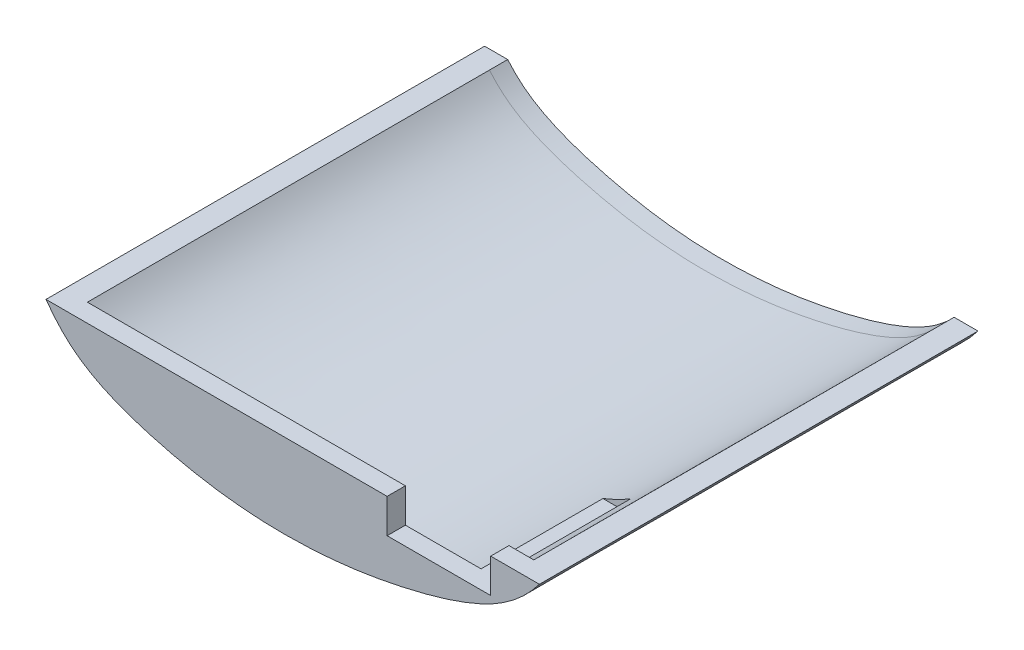
ISO-10303-21;
HEADER;
FILE_DESCRIPTION(('STEP AP214'),'2;1');
FILE_NAME('part.step','',(''),(''),'','','');
FILE_SCHEMA(('AUTOMOTIVE_DESIGN { 1 0 10303 214 1 1 1 1 }'));
ENDSEC;
DATA;
#1=APPLICATION_CONTEXT('core data for automotive mechanical design processes');
#2=APPLICATION_PROTOCOL_DEFINITION('international standard','automotive_design',2000,#1);
#3=PRODUCT_CONTEXT('',#1,'mechanical');
#4=PRODUCT('Part','Part','',(#3));
#5=PRODUCT_RELATED_PRODUCT_CATEGORY('part','',(#4));
#6=PRODUCT_DEFINITION_FORMATION('','',#4);
#7=PRODUCT_DEFINITION_CONTEXT('part definition',#1,'design');
#8=PRODUCT_DEFINITION('design','',#6,#7);
#9=PRODUCT_DEFINITION_SHAPE('','',#8);
#10=(LENGTH_UNIT() NAMED_UNIT(*) SI_UNIT(.MILLI.,.METRE.));
#11=(NAMED_UNIT(*) PLANE_ANGLE_UNIT() SI_UNIT($,.RADIAN.));
#12=(NAMED_UNIT(*) SI_UNIT($,.STERADIAN.) SOLID_ANGLE_UNIT());
#13=UNCERTAINTY_MEASURE_WITH_UNIT(LENGTH_MEASURE(1.E-05),#10,'distance_accuracy_value','');
#14=(GEOMETRIC_REPRESENTATION_CONTEXT(3) GLOBAL_UNCERTAINTY_ASSIGNED_CONTEXT((#13)) GLOBAL_UNIT_ASSIGNED_CONTEXT((#10,
#11,#12)) REPRESENTATION_CONTEXT('',''));
#15=CARTESIAN_POINT('',(0.,0.,0.));
#16=DIRECTION('',(0.,0.,1.));
#17=DIRECTION('',(1.,0.,0.));
#18=AXIS2_PLACEMENT_3D('',#15,#16,#17);
#19=CARTESIAN_POINT('',(40.5,-2.,6.));
#20=DIRECTION('',(0.,1.,0.));
#21=DIRECTION('',(0.,0.,1.));
#22=AXIS2_PLACEMENT_3D('',#19,#20,#21);
#23=PLANE('',#22);
#24=DIRECTION('',(0.,0.,1.));
#25=VECTOR('',#24,1.);
#26=CARTESIAN_POINT('',(28.,-2.,6.));
#27=LINE('',#26,#25);
#28=CARTESIAN_POINT('',(28.,-2.,40.5));
#29=VERTEX_POINT('',#28);
#30=CARTESIAN_POINT('',(28.,-2.,42.));
#31=VERTEX_POINT('',#30);
#32=EDGE_CURVE('E137',#29,#31,#27,.T.);
#33=ORIENTED_EDGE('',*,*,#32,.F.);
#34=DIRECTION('',(-1.,0.,0.));
#35=VECTOR('',#34,1.);
#36=CARTESIAN_POINT('',(40.5,-2.,40.5));
#37=LINE('',#36,#35);
#38=CARTESIAN_POINT('',(1.89820136982671,-2.,40.5));
#39=VERTEX_POINT('',#38);
#40=EDGE_CURVE('E273',#29,#39,#37,.T.);
#41=ORIENTED_EDGE('',*,*,#40,.T.);
#42=DIRECTION('',(0.,0.,1.));
#43=VECTOR('',#42,1.);
#44=CARTESIAN_POINT('',(1.89820136982671,-2.,40.5));
#45=LINE('',#44,#43);
#46=CARTESIAN_POINT('',(1.89820136982672,-2.,7.5));
#47=VERTEX_POINT('',#46);
#48=EDGE_CURVE('E341',#39,#47,#45,.F.);
#49=ORIENTED_EDGE('',*,*,#48,.T.);
#50=DIRECTION('',(0.,0.,1.));
#51=VECTOR('',#50,1.);
#52=CARTESIAN_POINT('',(1.89820136982672,-2.,5.85000000000009));
#53=LINE('',#52,#51);
#54=CARTESIAN_POINT('',(1.89820136982672,-2.,6.));
#55=VERTEX_POINT('',#54);
#56=EDGE_CURVE('E176',#55,#47,#53,.T.);
#57=ORIENTED_EDGE('',*,*,#56,.F.);
#58=DIRECTION('',(-1.,0.,0.));
#59=VECTOR('',#58,1.);
#60=CARTESIAN_POINT('',(40.5,-2.,6.));
#61=LINE('',#60,#59);
#62=CARTESIAN_POINT('',(0.000230500000000689,-2.,6.));
#63=VERTEX_POINT('',#62);
#64=EDGE_CURVE('E241',#55,#63,#61,.T.);
#65=ORIENTED_EDGE('',*,*,#64,.T.);
#66=DIRECTION('',(0.,0.,1.));
#67=VECTOR('',#66,1.);
#68=CARTESIAN_POINT('',(0.000230500000000689,-2.,6.));
#69=LINE('',#68,#67);
#70=CARTESIAN_POINT('',(0.000230500000000689,-2.,42.));
#71=VERTEX_POINT('',#70);
#72=EDGE_CURVE('E327',#71,#63,#69,.F.);
#73=ORIENTED_EDGE('',*,*,#72,.F.);
#74=DIRECTION('',(-1.,0.,0.));
#75=VECTOR('',#74,1.);
#76=CARTESIAN_POINT('',(40.5,-2.,42.));
#77=LINE('',#76,#75);
#78=EDGE_CURVE('E315',#31,#71,#77,.T.);
#79=ORIENTED_EDGE('',*,*,#78,.F.);
#80=EDGE_LOOP('',(#33,#41,#49,#57,#65,#73,#79));
#81=FACE_BOUND('',#80,.T.);
#82=ADVANCED_FACE('F17',(#81),#23,.T.);
#83=CARTESIAN_POINT('',(19.8662950637951,-8.90434168798936,40.5));
#84=DIRECTION('',(0.,0.,-1.));
#85=DIRECTION('',(1.,0.,0.));
#86=AXIS2_PLACEMENT_3D('',#83,#84,#85);
#87=PLANE('',#86);
#88=DIRECTION('',(0.,-1.,0.));
#89=VECTOR('',#88,1.);
#90=CARTESIAN_POINT('',(36.5,-8.90434168798936,40.5));
#91=LINE('',#90,#89);
#92=CARTESIAN_POINT('',(36.5,-2.,40.5));
#93=VERTEX_POINT('',#92);
#94=CARTESIAN_POINT('',(36.5,-3.66892450240121,40.5));
#95=VERTEX_POINT('',#94);
#96=EDGE_CURVE('E31',#93,#95,#91,.T.);
#97=ORIENTED_EDGE('',*,*,#96,.F.);
#98=CARTESIAN_POINT('',(38.5382006752774,-2.,40.5));
#99=VERTEX_POINT('',#98);
#100=EDGE_CURVE('E265',#99,#93,#37,.T.);
#101=ORIENTED_EDGE('',*,*,#100,.F.);
#102=CARTESIAN_POINT('',(1.89820136982671,-2.,40.5));
#103=CARTESIAN_POINT('',(2.00083003310664,-2.12041762852252,40.5000000000001));
#104=CARTESIAN_POINT('',(2.10604483115259,-2.2386689501225,40.5000000000001));
#105=CARTESIAN_POINT('',(2.32152162943008,-2.46989976937524,40.5000000000001));
#106=CARTESIAN_POINT('',(2.43176978911935,-2.58289217985561,40.5000000000001));
#107=CARTESIAN_POINT('',(2.65749913152029,-2.80308300431878,40.5000000000001));
#108=CARTESIAN_POINT('',(2.77296963343779,-2.91029234097288,40.5000000000001));
#109=CARTESIAN_POINT('',(3.0092273969493,-3.11848265996382,40.5000000000001));
#110=CARTESIAN_POINT('',(3.13000976892064,-3.21946917300463,40.5000000000001));
#111=CARTESIAN_POINT('',(3.31400481589099,-3.36512382245532,40.5000000000001));
#112=CARTESIAN_POINT('',(3.3752422842266,-3.4123044454689,40.5000000000001));
#113=CARTESIAN_POINT('',(3.49895302951827,-3.50501686976352,40.5000000000001));
#114=CARTESIAN_POINT('',(3.5614263022646,-3.55054867665973,40.5000000000001));
#115=CARTESIAN_POINT('',(3.75058784602209,-3.68475970057501,40.5000000000001));
#116=CARTESIAN_POINT('',(3.87899015133936,-3.77103267368491,40.5000000000001));
#117=CARTESIAN_POINT('',(4.13957950097387,-3.93777326007497,40.5000000000001));
#118=CARTESIAN_POINT('',(4.27176845847251,-4.01823786378506,40.5000000000001));
#119=CARTESIAN_POINT('',(4.53923264428156,-4.17383906765259,40.5000000000001));
#120=CARTESIAN_POINT('',(4.67450785773528,-4.24897569345086,40.5));
#121=CARTESIAN_POINT('',(5.0546255834656,-4.45140412085583,40.5));
#122=CARTESIAN_POINT('',(5.30227488557212,-4.57343682116008,40.5));
#123=CARTESIAN_POINT('',(5.80360238994257,-4.8045988584823,40.5000000000001));
#124=CARTESIAN_POINT('',(6.0572836542603,-4.91372146632188,40.5000000000001));
#125=CARTESIAN_POINT('',(6.56940721361049,-5.1211454808542,40.5000000000001));
#126=CARTESIAN_POINT('',(6.82785550446699,-5.21943199610056,40.5000000000001));
#127=CARTESIAN_POINT('',(7.34837087425427,-5.40680142478395,40.5000000000001));
#128=CARTESIAN_POINT('',(7.61044169005245,-5.49587388202048,40.5000000000001));
#129=CARTESIAN_POINT('',(8.1371729088616,-5.66614845948441,40.5000000000001));
#130=CARTESIAN_POINT('',(8.40183384328292,-5.74734892570979,40.5000000000001));
#131=CARTESIAN_POINT('',(8.93792621938398,-5.90453680297366,40.5000000000001));
#132=CARTESIAN_POINT('',(9.20939320667267,-5.98040240723568,40.5000000000001));
#133=CARTESIAN_POINT('',(9.61756590533864,-6.08991354173451,40.5000000000001));
#134=CARTESIAN_POINT('',(9.75370766127733,-6.12568354566409,40.5000000000001));
#135=CARTESIAN_POINT('',(10.0263203742806,-6.19594657658084,40.5000000000001));
#136=CARTESIAN_POINT('',(10.1627913309865,-6.23043960495853,40.5));
#137=CARTESIAN_POINT('',(10.5724896740277,-6.33188780720992,40.5));
#138=CARTESIAN_POINT('',(10.8462092540068,-6.39686754399802,40.5));
#139=CARTESIAN_POINT('',(11.3947981603253,-6.52125797375342,40.5));
#140=CARTESIAN_POINT('',(11.6696669876823,-6.58067086493684,40.5));
#141=CARTESIAN_POINT('',(12.220592478091,-6.69369944993921,40.5));
#142=CARTESIAN_POINT('',(12.4966491490258,-6.74731510522264,40.5));
#143=CARTESIAN_POINT('',(13.3088512312554,-6.89588400854173,40.5));
#144=CARTESIAN_POINT('',(13.8465434657899,-6.98254664257681,40.5));
#145=CARTESIAN_POINT('',(14.925550010286,-7.13202365999072,40.5));
#146=CARTESIAN_POINT('',(15.4668662640761,-7.19482399101907,40.5));
#147=CARTESIAN_POINT('',(16.5519905380727,-7.29605759648399,40.5));
#148=CARTESIAN_POINT('',(17.0957994584553,-7.33448123155406,40.5));
#149=CARTESIAN_POINT('',(18.1846642227836,-7.3874093071454,40.5));
#150=CARTESIAN_POINT('',(18.7297202727932,-7.40190945833182,40.5));
#151=CARTESIAN_POINT('',(19.8144430594335,-7.40833327706315,40.5));
#152=CARTESIAN_POINT('',(20.3541087939234,-7.40048282408675,40.5));
#153=CARTESIAN_POINT('',(21.4327440426455,-7.36494611703388,40.5));
#154=CARTESIAN_POINT('',(21.9717136009242,-7.33726118634803,40.5));
#155=CARTESIAN_POINT('',(23.0480711376848,-7.26102744177884,40.5));
#156=CARTESIAN_POINT('',(23.5854594344493,-7.21248316377933,40.5));
#157=CARTESIAN_POINT('',(24.6577623140746,-7.09453591233781,40.5));
#158=CARTESIAN_POINT('',(25.1926776415342,-7.02513969757321,40.5));
#159=CARTESIAN_POINT('',(26.1202087326554,-6.8872873138493,40.5));
#160=CARTESIAN_POINT('',(26.513499425086,-6.82331990477343,40.5));
#161=CARTESIAN_POINT('',(27.1020773115475,-6.71978669216772,40.4999999999999));
#162=CARTESIAN_POINT('',(27.2980381348379,-6.68401304166714,40.4999999999999));
#163=CARTESIAN_POINT('',(27.6895015543667,-6.61003352364393,40.4999999999999));
#164=CARTESIAN_POINT('',(27.8850041490312,-6.57182764777995,40.4999999999999));
#165=CARTESIAN_POINT('',(28.2755714890389,-6.49306944692754,40.4999999999999));
#166=CARTESIAN_POINT('',(28.4706361504276,-6.45251670629462,40.4999999999999));
#167=CARTESIAN_POINT('',(28.8602915934307,-6.3691946903258,40.4999999999999));
#168=CARTESIAN_POINT('',(29.0548823745473,-6.32642541266187,40.4999999999999));
#169=CARTESIAN_POINT('',(29.4445603998845,-6.23832645313602,40.4999999999999));
#170=CARTESIAN_POINT('',(29.6396448744314,-6.19298449066991,40.4999999999999));
#171=CARTESIAN_POINT('',(30.0292035512473,-6.09975630626065,40.4999999999999));
#172=CARTESIAN_POINT('',(30.2236777549775,-6.05187009041464,40.4999999999999));
#173=CARTESIAN_POINT('',(30.8059946979535,-5.90411890653884,40.4999999999999));
#174=CARTESIAN_POINT('',(31.1928065625797,-5.80014465524086,40.4999999999999));
#175=CARTESIAN_POINT('',(31.9626583881571,-5.57926894043876,40.4999999999999));
#176=CARTESIAN_POINT('',(32.345699288834,-5.46237079118438,40.5));
#177=CARTESIAN_POINT('',(32.9085383136561,-5.27779342485046,40.5));
#178=CARTESIAN_POINT('',(33.090329923843,-5.21617355536031,40.4999999999999));
#179=CARTESIAN_POINT('',(33.4525025464162,-5.08890481034306,40.4999999999999));
#180=CARTESIAN_POINT('',(33.6328835626763,-5.02325594588432,40.4999999999999));
#181=CARTESIAN_POINT('',(33.9920376702233,-4.88742329757447,40.4999999999999));
#182=CARTESIAN_POINT('',(34.170809913008,-4.81723726406419,40.4999999999999));
#183=CARTESIAN_POINT('',(34.5262844728385,-4.67177784632501,40.4999999999999));
#184=CARTESIAN_POINT('',(34.7029867593906,-4.59650438726059,40.4999999999999));
#185=CARTESIAN_POINT('',(35.0522940435741,-4.44083449431221,40.4999999999999));
#186=CARTESIAN_POINT('',(35.2249212806481,-4.36048812529077,40.4999999999999));
#187=CARTESIAN_POINT('',(35.5669918614827,-4.19322187487431,40.4999999999999));
#188=CARTESIAN_POINT('',(35.7364351625076,-4.10630190532519,40.4999999999999));
#189=CARTESIAN_POINT('',(35.9873830857114,-3.97020859944181,40.4999999999999));
#190=CARTESIAN_POINT('',(36.0704543159964,-3.92391721759707,40.4999999999999));
#191=CARTESIAN_POINT('',(36.2354009755563,-3.82925217690623,40.4999999999999));
#192=CARTESIAN_POINT('',(36.3172763991931,-3.78087850824662,40.4999999999999));
#193=CARTESIAN_POINT('',(36.5609375507431,-3.63260189795209,40.4999999999999));
#194=CARTESIAN_POINT('',(36.7208102423147,-3.52951526348172,40.5));
#195=CARTESIAN_POINT('',(36.9775858528581,-3.35377984136878,40.5));
#196=CARTESIAN_POINT('',(37.0762522760367,-3.28368936064456,40.4999999999999));
#197=CARTESIAN_POINT('',(37.2710356941909,-3.14001542563336,40.4999999999998));
#198=CARTESIAN_POINT('',(37.3671523366213,-3.06643149220786,40.4999999999999));
#199=CARTESIAN_POINT('',(37.5566631133341,-2.91582550336033,40.4999999999999));
#200=CARTESIAN_POINT('',(37.6500570571815,-2.83880320839679,40.4999999999999));
#201=CARTESIAN_POINT('',(37.8350042780706,-2.68054557293241,40.4999999999999));
#202=CARTESIAN_POINT('',(37.9265257300119,-2.59927303016159,40.4999999999999));
#203=CARTESIAN_POINT('',(38.106539252317,-2.43345247371134,40.4999999999999));
#204=CARTESIAN_POINT('',(38.1950315063444,-2.34890465928029,40.4999999999998));
#205=CARTESIAN_POINT('',(38.368934207929,-2.17672379115764,40.4999999999999));
#206=CARTESIAN_POINT('',(38.4543451529351,-2.08909124002239,40.4999999999999));
#207=CARTESIAN_POINT('',(38.5382006752774,-2.,40.5));
#208=B_SPLINE_CURVE_WITH_KNOTS('',3,(#102,#103,#104,#105,#106,#107,#108,#109,#110,#111,#112,
#113,#114,#115,#116,#117,#118,#119,#120,#121,#122,#123,#124,#125,#126,#127,#128,#129,#130,#131,
#132,#133,#134,#135,#136,#137,#138,#139,#140,#141,#142,#143,#144,#145,#146,#147,#148,#149,#150,
#151,#152,#153,#154,#155,#156,#157,#158,#159,#160,#161,#162,#163,#164,#165,#166,#167,#168,#169,
#170,#171,#172,#173,#174,#175,#176,#177,#178,#179,#180,#181,#182,#183,#184,#185,#186,#187,#188,
#189,#190,#191,#192,#193,#194,#195,#196,#197,#198,#199,#200,#201,#202,#203,#204,#205,#206,#207),
.UNSPECIFIED.,.F.,.F.,(4,2,2,2,2,2,2,2,2,2,2,2,2,2,2,2,2,2,2,2,2,2,2,2,2,2,2,2,2,2,2,2,2,2,2,2,
2,2,2,2,2,2,2,2,2,2,2,2,2,2,2,2,4),(0.,0.474662618182783,0.948090556586381,1.42059053112625,
1.89266431426562,2.124555357897,2.35644561173245,2.82033180275154,3.28445665338628,
3.74857927027525,4.57633057780913,5.4045114540942,6.23381662867832,7.06405281411066,
7.89446306599801,8.73999007087165,9.16227263424755,9.58455473778335,10.4284769700363,
11.2720645403418,12.1156577178169,13.748998990029,15.3833006407224,17.0182481471733,
18.6534887579045,20.2722621526471,21.8909275500895,23.5092411452669,25.1270307659723,
26.3222669065307,26.9198516418769,27.5174384267608,28.1151313738542,28.7128249487172,
29.3136613160345,29.9144962435476,31.1159362400249,32.3170688465602,32.8928839052729,
33.4686973821903,34.0447985869817,34.6209082680097,35.1920239342125,35.7631472606183,
36.0484155907542,36.3336852654649,36.9040472933925,37.26706484442,37.6301323291517,
37.9932251474255,38.3603377717367,38.7274280980246,39.0944588933234),.UNSPECIFIED.);
#209=EDGE_CURVE('E263',#95,#99,#208,.T.);
#210=ORIENTED_EDGE('',*,*,#209,.F.);
#211=EDGE_LOOP('',(#97,#101,#210));
#212=FACE_BOUND('',#211,.T.);
#213=ADVANCED_FACE('F264',(#212),#87,.T.);
#214=CARTESIAN_POINT('',(19.8662950637951,-8.90434168798935,6.));
#215=DIRECTION('',(0.,0.,-1.));
#216=DIRECTION('',(1.,0.,0.));
#217=AXIS2_PLACEMENT_3D('',#214,#215,#216);
#218=PLANE('',#217);
#219=ORIENTED_EDGE('',*,*,#64,.F.);
#220=CARTESIAN_POINT('',(1.89820136982672,-2.,6.00000000000009));
#221=CARTESIAN_POINT('',(2.16697650434004,-2.31529273616505,6.00000000000009));
#222=CARTESIAN_POINT('',(2.45037312983766,-2.61224095305659,6.00000000000009));
#223=CARTESIAN_POINT('',(3.05091479946776,-3.16379570521762,6.00000000000009));
#224=CARTESIAN_POINT('',(3.36828874709754,-3.41811505194914,6.00000000000009));
#225=CARTESIAN_POINT('',(4.03802403447801,-3.88285761404089,6.00000000000009));
#226=CARTESIAN_POINT('',(4.38935622458216,-4.09457202846874,6.00000000000008));
#227=CARTESIAN_POINT('',(5.11692435927022,-4.48675593130919,6.00000000000008));
#228=CARTESIAN_POINT('',(5.48799693773843,-4.66440371648487,6.00000000000008));
#229=CARTESIAN_POINT('',(6.61211039520767,-5.15513354498113,6.00000000000007));
#230=CARTESIAN_POINT('',(7.37838730167798,-5.4280483779563,6.00000000000007));
#231=CARTESIAN_POINT('',(8.93015873772476,-5.91208429906894,6.));
#232=CARTESIAN_POINT('',(9.71562345272932,-6.12330125515208,6.));
#233=CARTESIAN_POINT('',(11.2985953682724,-6.50701288235191,6.));
#234=CARTESIAN_POINT('',(12.097681341838,-6.67694093374471,6.));
#235=CARTESIAN_POINT('',(13.7084191357647,-6.96591270314503,6.));
#236=CARTESIAN_POINT('',(14.514091209991,-7.08385494404437,6.));
#237=CARTESIAN_POINT('',(16.932042162335,-7.35584462186562,6.));
#238=CARTESIAN_POINT('',(18.5452766078722,-7.42623063588677,6.));
#239=CARTESIAN_POINT('',(21.7739370078635,-7.37513262888282,6.));
#240=CARTESIAN_POINT('',(23.3892992676337,-7.25922517710589,6.));
#241=CARTESIAN_POINT('',(25.4098807695953,-6.9936355118318,6.));
#242=CARTESIAN_POINT('',(25.8144862412497,-6.93452831457946,6.));
#243=CARTESIAN_POINT('',(26.6208151284551,-6.80539936191854,6.));
#244=CARTESIAN_POINT('',(27.0227240572306,-6.73537016631639,6.));
#245=CARTESIAN_POINT('',(28.224945744805,-6.51002638317981,6.));
#246=CARTESIAN_POINT('',(29.021976605892,-6.34042709801688,5.99999999999993));
#247=CARTESIAN_POINT('',(30.6069908207764,-5.96184859654685,5.99999999999992));
#248=CARTESIAN_POINT('',(31.3947777323978,-5.75201435143263,5.99999999999991));
#249=CARTESIAN_POINT('',(32.5661431122419,-5.39236625276407,5.99999999999991));
#250=CARTESIAN_POINT('',(32.9552791866616,-5.26474741794547,5.9999999999999));
#251=CARTESIAN_POINT('',(33.7244834981406,-4.99199525809116,5.9999999999999));
#252=CARTESIAN_POINT('',(34.1050081846746,-4.846781752214,5.99999999999989));
#253=CARTESIAN_POINT('',(35.2306686581127,-4.37665044330114,5.99999999999988));
#254=CARTESIAN_POINT('',(35.9609002220761,-4.01942952283036,5.99999999999988));
#255=CARTESIAN_POINT('',(36.8225379641477,-3.46203816344741,5.99999999999987));
#256=CARTESIAN_POINT('',(36.9925943009499,-3.34489035066724,5.99999999999987));
#257=CARTESIAN_POINT('',(37.323725707048,-3.10161138849551,5.99999999999986));
#258=CARTESIAN_POINT('',(37.4852265153492,-2.97522572176107,5.99999999999986));
#259=CARTESIAN_POINT('',(37.9574204977592,-2.5816973400727,5.99999999999986));
#260=CARTESIAN_POINT('',(38.2557138753548,-2.30007657835344,5.99999999999985));
#261=CARTESIAN_POINT('',(38.5382006752774,-2.,5.99999999999985));
#262=B_SPLINE_CURVE_WITH_KNOTS('',3,(#220,#221,#222,#223,#224,#225,#226,#227,#228,#229,#230,
#231,#232,#233,#234,#235,#236,#237,#238,#239,#240,#241,#242,#243,#244,#245,#246,#247,#248,#249,
#250,#251,#252,#253,#254,#255,#256,#257,#258,#259,#260,#261),.UNSPECIFIED.,.F.,.F.,(4,2,2,2,2,2,
2,2,2,2,2,2,2,2,2,2,2,2,2,2,4),(0.,0.03125,0.0625,0.09375,0.125,0.1875,0.25,0.3125,0.375,0.5,
0.625,0.65625,0.6875,0.75,0.8125,0.84375,0.875,0.9375,0.953125,0.96875,1.),.UNSPECIFIED.);
#263=CARTESIAN_POINT('',(38.5382006752774,-2.,6.));
#264=VERTEX_POINT('',#263);
#265=EDGE_CURVE('E175',#55,#264,#262,.T.);
#266=ORIENTED_EDGE('',*,*,#265,.T.);
#267=CARTESIAN_POINT('',(40.5,-2.,6.));
#268=VERTEX_POINT('',#267);
#269=EDGE_CURVE('E331',#268,#264,#61,.T.);
#270=ORIENTED_EDGE('',*,*,#269,.F.);
#271=CARTESIAN_POINT('',(0.000230500000000689,-2.,6.));
#272=CARTESIAN_POINT('',(0.739150769022203,-3.03726321863002,6.));
#273=CARTESIAN_POINT('',(3.12649338618059,-5.64396851218127,6.));
#274=CARTESIAN_POINT('',(11.4702662698805,-8.47207769697183,6.));
#275=CARTESIAN_POINT('',(19.7044952136281,-9.23999643668314,6.));
#276=CARTESIAN_POINT('',(28.4856403512339,-8.21638060836186,6.));
#277=CARTESIAN_POINT('',(36.7942535663366,-5.83035136597628,6.));
#278=CARTESIAN_POINT('',(39.5504796655932,-3.244792146525,6.));
#279=CARTESIAN_POINT('',(40.5,-2.,6.));
#280=B_SPLINE_CURVE_WITH_KNOTS('',3,(#271,#272,#273,#274,#275,#276,#277,#278,#279),
.UNSPECIFIED.,.F.,.F.,(4,1,1,1,1,1,4),(0.,0.0878985909563981,0.25059951239453,0.529512710556188,
0.714586405415058,0.881767774039842,1.),.UNSPECIFIED.);
#281=EDGE_CURVE('E280',#63,#268,#280,.T.);
#282=ORIENTED_EDGE('',*,*,#281,.F.);
#283=EDGE_LOOP('',(#219,#266,#270,#282));
#284=FACE_BOUND('',#283,.T.);
#285=ADVANCED_FACE('F289',(#284),#218,.T.);
#286=DIRECTION('',(0.,0.,-1.));
#287=VECTOR('',#286,1.);
#288=CARTESIAN_POINT('',(36.5,-2.,6.));
#289=LINE('',#288,#287);
#290=CARTESIAN_POINT('',(36.5,-2.,42.));
#291=VERTEX_POINT('',#290);
#292=EDGE_CURVE('E170',#291,#93,#289,.T.);
#293=ORIENTED_EDGE('',*,*,#292,.F.);
#294=CARTESIAN_POINT('',(40.5,-2.,42.));
#295=VERTEX_POINT('',#294);
#296=EDGE_CURVE('E309',#295,#291,#77,.T.);
#297=ORIENTED_EDGE('',*,*,#296,.F.);
#298=DIRECTION('',(0.,0.,1.));
#299=VECTOR('',#298,1.);
#300=CARTESIAN_POINT('',(40.5,-2.,6.));
#301=LINE('',#300,#299);
#302=EDGE_CURVE('E247',#268,#295,#301,.T.);
#303=ORIENTED_EDGE('',*,*,#302,.F.);
#304=ORIENTED_EDGE('',*,*,#269,.T.);
#305=DIRECTION('',(0.,0.,1.));
#306=VECTOR('',#305,1.);
#307=CARTESIAN_POINT('',(38.5382006752774,-2.,5.84999999999985));
#308=LINE('',#307,#306);
#309=CARTESIAN_POINT('',(38.5382006752774,-2.,7.49999999999984));
#310=VERTEX_POINT('',#309);
#311=EDGE_CURVE('E46',#310,#264,#308,.F.);
#312=ORIENTED_EDGE('',*,*,#311,.F.);
#313=DIRECTION('',(0.,0.,1.));
#314=VECTOR('',#313,1.);
#315=CARTESIAN_POINT('',(38.5382006752774,-2.,7.49999999999984));
#316=LINE('',#315,#314);
#317=EDGE_CURVE('E376',#310,#99,#316,.T.);
#318=ORIENTED_EDGE('',*,*,#317,.T.);
#319=ORIENTED_EDGE('',*,*,#100,.T.);
#320=EDGE_LOOP('',(#293,#297,#303,#304,#312,#318,#319));
#321=FACE_BOUND('',#320,.T.);
#322=ADVANCED_FACE('F19',(#321),#23,.T.);
#323=DIRECTION('',(0.,0.,1.));
#324=VECTOR('',#323,1.);
#325=SURFACE_OF_LINEAR_EXTRUSION('',#280,#324);
#326=CARTESIAN_POINT('',(0.000230500000000689,-2.,42.));
#327=CARTESIAN_POINT('',(0.739150769022203,-3.03726321863002,42.));
#328=CARTESIAN_POINT('',(3.12649338618059,-5.64396851218127,42.));
#329=CARTESIAN_POINT('',(11.4702662698805,-8.47207769697183,42.));
#330=CARTESIAN_POINT('',(19.7044952136281,-9.23999643668314,42.));
#331=CARTESIAN_POINT('',(28.4856403512339,-8.21638060836186,42.));
#332=CARTESIAN_POINT('',(36.7942535663366,-5.83035136597628,42.));
#333=CARTESIAN_POINT('',(39.5504796655932,-3.244792146525,42.));
#334=CARTESIAN_POINT('',(40.5,-2.,42.));
#335=B_SPLINE_CURVE_WITH_KNOTS('',3,(#326,#327,#328,#329,#330,#331,#332,#333,#334),
.UNSPECIFIED.,.F.,.F.,(4,1,1,1,1,1,4),(0.,0.0878985909563981,0.25059951239453,0.529512710556188,
0.714586405415058,0.881767774039842,1.),.UNSPECIFIED.);
#336=EDGE_CURVE('E313',#71,#295,#335,.T.);
#337=ORIENTED_EDGE('',*,*,#336,.F.);
#338=ORIENTED_EDGE('',*,*,#72,.T.);
#339=ORIENTED_EDGE('',*,*,#281,.T.);
#340=ORIENTED_EDGE('',*,*,#302,.T.);
#341=EDGE_LOOP('',(#337,#338,#339,#340));
#342=FACE_BOUND('',#341,.T.);
#343=ADVANCED_FACE('F217',(#342),#325,.T.);
#344=CARTESIAN_POINT('',(19.8662950637951,-8.90434168798935,42.));
#345=DIRECTION('',(0.,0.,-1.));
#346=DIRECTION('',(1.,0.,0.));
#347=AXIS2_PLACEMENT_3D('',#344,#345,#346);
#348=PLANE('',#347);
#349=DIRECTION('',(1.,0.,0.));
#350=VECTOR('',#349,1.);
#351=CARTESIAN_POINT('',(28.,-4.8,42.));
#352=LINE('',#351,#350);
#353=CARTESIAN_POINT('',(28.,-4.8,42.));
#354=VERTEX_POINT('',#353);
#355=CARTESIAN_POINT('',(36.5,-4.8,42.));
#356=VERTEX_POINT('',#355);
#357=EDGE_CURVE('E126',#354,#356,#352,.T.);
#358=ORIENTED_EDGE('',*,*,#357,.F.);
#359=DIRECTION('',(0.,1.,0.));
#360=VECTOR('',#359,1.);
#361=CARTESIAN_POINT('',(28.,-4.8,42.));
#362=LINE('',#361,#360);
#363=EDGE_CURVE('E134',#354,#31,#362,.T.);
#364=ORIENTED_EDGE('',*,*,#363,.T.);
#365=ORIENTED_EDGE('',*,*,#78,.T.);
#366=ORIENTED_EDGE('',*,*,#336,.T.);
#367=ORIENTED_EDGE('',*,*,#296,.T.);
#368=DIRECTION('',(0.,1.,0.));
#369=VECTOR('',#368,1.);
#370=CARTESIAN_POINT('',(36.5,-4.8,42.));
#371=LINE('',#370,#369);
#372=EDGE_CURVE('E141',#356,#291,#371,.T.);
#373=ORIENTED_EDGE('',*,*,#372,.F.);
#374=EDGE_LOOP('',(#358,#364,#365,#366,#367,#373));
#375=FACE_BOUND('',#374,.T.);
#376=ADVANCED_FACE('F143',(#375),#348,.F.);
#377=CARTESIAN_POINT('',(0.000230500000000689,-2.,6.));
#378=CARTESIAN_POINT('',(0.739150769022203,-3.03726321863002,6.));
#379=CARTESIAN_POINT('',(3.12649338618059,-5.64396851218127,6.));
#380=CARTESIAN_POINT('',(11.4702662698805,-8.47207769697183,6.));
#381=CARTESIAN_POINT('',(19.7044952136281,-9.23999643668314,6.));
#382=CARTESIAN_POINT('',(28.4856403512339,-8.21638060836186,6.));
#383=CARTESIAN_POINT('',(36.7942535663366,-5.83035136597628,6.));
#384=CARTESIAN_POINT('',(39.5504796655932,-3.244792146525,6.));
#385=CARTESIAN_POINT('',(40.5,-2.,6.));
#386=B_SPLINE_CURVE_WITH_KNOTS('',3,(#377,#378,#379,#380,#381,#382,#383,#384,#385),
.UNSPECIFIED.,.F.,.F.,(4,1,1,1,1,1,4),(0.,0.0878985909563981,0.25059951239453,0.529512710556188,
0.714586405415058,0.881767774039842,1.),.UNSPECIFIED.);
#387=DIRECTION('',(0.,0.,1.));
#388=VECTOR('',#387,1.);
#389=SURFACE_OF_LINEAR_EXTRUSION('',#386,#388);
#390=OFFSET_SURFACE('',#389,-1.5,.F.);
#391=CARTESIAN_POINT('',(34.2115157990849,-4.8,30.5));
#392=CARTESIAN_POINT('',(34.3105138189435,-4.76031970015726,30.5));
#393=CARTESIAN_POINT('',(34.4092114641316,-4.71988303828376,30.5));
#394=CARTESIAN_POINT('',(34.6057978846003,-4.63742677470297,30.5));
#395=CARTESIAN_POINT('',(34.7036875163082,-4.59540921351938,30.5));
#396=CARTESIAN_POINT('',(34.8986035532838,-4.50966375385733,30.5));
#397=CARTESIAN_POINT('',(34.9956306997607,-4.46593754326324,30.5));
#398=CARTESIAN_POINT('',(35.1887549528257,-4.37662311050665,30.5));
#399=CARTESIAN_POINT('',(35.284852581152,-4.33103601810247,30.5));
#400=CARTESIAN_POINT('',(35.4760833387121,-4.23779938690174,30.5));
#401=CARTESIAN_POINT('',(35.5712161361762,-4.19014916649342,30.5));
#402=CARTESIAN_POINT('',(35.7603684963751,-4.092608110205,30.5));
#403=CARTESIAN_POINT('',(35.8543876763912,-4.0427165307387,30.5));
#404=CARTESIAN_POINT('',(36.0411692485083,-3.9404281209151,30.5));
#405=CARTESIAN_POINT('',(36.1339304053642,-3.88802902893014,30.5));
#406=CARTESIAN_POINT('',(36.3180818453766,-3.78052663221111,30.5));
#407=CARTESIAN_POINT('',(36.4094695397977,-3.72541889648027,30.5));
#408=CARTESIAN_POINT('',(36.5,-3.66892450240289,30.5));
#409=B_SPLINE_CURVE_WITH_KNOTS('',3,(#391,#392,#393,#394,#395,#396,#397,#398,#399,#400,#401,
#402,#403,#404,#405,#406,#407,#408),.UNSPECIFIED.,.F.,.F.,(4,2,2,2,2,2,2,2,4),(0.,
0.319963545939205,0.639527390790145,0.958783163170667,1.27784791407675,1.59701889348055,
1.91629655348827,2.23586781996981,2.55598049414603),.UNSPECIFIED.);
#410=CARTESIAN_POINT('',(34.2115157990829,-4.8,30.5));
#411=VERTEX_POINT('',#410);
#412=CARTESIAN_POINT('',(36.5,-3.66892450240289,30.5));
#413=VERTEX_POINT('',#412);
#414=EDGE_CURVE('E11',#411,#413,#409,.T.);
#415=ORIENTED_EDGE('',*,*,#414,.T.);
#416=DIRECTION('',(0.,0.,1.));
#417=VECTOR('',#416,1.);
#418=CARTESIAN_POINT('',(36.5,-3.66892450240289,24.));
#419=LINE('',#418,#417);
#420=EDGE_CURVE('E166',#413,#95,#419,.T.);
#421=ORIENTED_EDGE('',*,*,#420,.T.);
#422=ORIENTED_EDGE('',*,*,#209,.T.);
#423=ORIENTED_EDGE('',*,*,#317,.F.);
#424=CARTESIAN_POINT('',(36.0628672598221,-3.92773171721378,7.49999999999987));
#425=CARTESIAN_POINT('',(36.2615456109789,-3.81593950542261,7.49999999999987));
#426=CARTESIAN_POINT('',(36.4574775794717,-3.69819483827251,7.49999999999987));
#427=CARTESIAN_POINT('',(36.8225379641477,-3.46203816344741,7.49999999999987));
#428=CARTESIAN_POINT('',(36.9925943009499,-3.34489035066724,7.49999999999986));
#429=CARTESIAN_POINT('',(37.323725707048,-3.10161138849551,7.49999999999986));
#430=CARTESIAN_POINT('',(37.4852265153492,-2.97522572176107,7.49999999999986));
#431=CARTESIAN_POINT('',(37.9574204977592,-2.5816973400727,7.49999999999985));
#432=CARTESIAN_POINT('',(38.2557138753548,-2.30007657835344,7.49999999999985));
#433=CARTESIAN_POINT('',(38.5382006752774,-2.,7.49999999999985));
#434=B_SPLINE_CURVE_WITH_KNOTS('',3,(#424,#425,#426,#427,#428,#429,#430,#431,#432,#433),
.UNSPECIFIED.,.F.,.F.,(4,2,2,2,4),(0.920024845305935,0.9375,0.953125,0.96875,1.),.UNSPECIFIED.);
#435=CARTESIAN_POINT('',(36.0628247833128,-3.92765626029136,7.5));
#436=VERTEX_POINT('',#435);
#437=EDGE_CURVE('E361',#436,#310,#434,.T.);
#438=ORIENTED_EDGE('',*,*,#437,.F.);
#439=CARTESIAN_POINT('',(27.4234645956784,-6.66025557645051,7.5));
#440=CARTESIAN_POINT('',(27.423464603704,-6.66025557494619,7.5));
#441=CARTESIAN_POINT('',(27.4234646117297,-6.66025557344186,7.5));
#442=CARTESIAN_POINT('',(28.224945744805,-6.51002638317981,7.5));
#443=CARTESIAN_POINT('',(29.021976605892,-6.34042709801688,7.49999999999993));
#444=CARTESIAN_POINT('',(30.6069908207764,-5.96184859654685,7.49999999999992));
#445=CARTESIAN_POINT('',(31.3947777323978,-5.75201435143263,7.49999999999991));
#446=CARTESIAN_POINT('',(32.5661431122419,-5.39236625276407,7.4999999999999));
#447=CARTESIAN_POINT('',(32.9552791866616,-5.26474741794547,7.4999999999999));
#448=CARTESIAN_POINT('',(33.7244834981406,-4.99199525809116,7.49999999999989));
#449=CARTESIAN_POINT('',(34.1050081846746,-4.846781752214,7.49999999999989));
#450=CARTESIAN_POINT('',(35.0208436884453,-4.46428369503207,7.49999999999988));
#451=CARTESIAN_POINT('',(35.5509712461342,-4.21576504970355,7.49999999999988));
#452=CARTESIAN_POINT('',(36.0628672598221,-3.92773171721378,7.49999999999987));
#453=B_SPLINE_CURVE_WITH_KNOTS('',3,(#439,#440,#441,#442,#443,#444,#445,#446,#447,#448,#449,
#450,#451,#452),.UNSPECIFIED.,.F.,.F.,(4,2,2,2,2,2,4),(0.687499999374153,0.6875,0.75,0.8125,
0.84375,0.875,0.920024845305935),.UNSPECIFIED.);
#454=CARTESIAN_POINT('',(27.4234645956784,-6.66025557645051,7.5));
#455=VERTEX_POINT('',#454);
#456=EDGE_CURVE('E360',#455,#436,#453,.T.);
#457=ORIENTED_EDGE('',*,*,#456,.F.);
#458=CARTESIAN_POINT('',(20.1596081723645,-7.40068161078973,7.5));
#459=CARTESIAN_POINT('',(21.7739379181095,-7.37513256356972,7.5));
#460=CARTESIAN_POINT('',(23.3892997230675,-7.25922511724268,7.5));
#461=CARTESIAN_POINT('',(25.4098807695953,-6.9936355118318,7.5));
#462=CARTESIAN_POINT('',(25.8144862412497,-6.93452831457946,7.5));
#463=CARTESIAN_POINT('',(26.6208151203809,-6.80539936321158,7.5));
#464=CARTESIAN_POINT('',(27.0227240411324,-6.73537016912135,7.5));
#465=CARTESIAN_POINT('',(27.4234645956784,-6.66025557645051,7.5));
#466=B_SPLINE_CURVE_WITH_KNOTS('',3,(#458,#459,#460,#461,#462,#463,#464,#465),.UNSPECIFIED.,.F.,
.F.,(4,2,2,4),(0.500000035218339,0.625,0.65625,0.687499999374153),.UNSPECIFIED.);
#467=CARTESIAN_POINT('',(20.1596081723645,-7.40068161078973,7.5));
#468=VERTEX_POINT('',#467);
#469=EDGE_CURVE('E192',#468,#455,#466,.T.);
#470=ORIENTED_EDGE('',*,*,#469,.F.);
#471=CARTESIAN_POINT('',(12.9030481300983,-6.8214264401364,7.5));
#472=CARTESIAN_POINT('',(12.9030488329993,-6.82142656623924,7.5));
#473=CARTESIAN_POINT('',(12.9030495359003,-6.82142669234207,7.5));
#474=CARTESIAN_POINT('',(13.7084191357647,-6.96591270314503,7.5));
#475=CARTESIAN_POINT('',(14.514091209991,-7.08385494404437,7.5));
#476=CARTESIAN_POINT('',(16.932042162335,-7.35584462186562,7.5));
#477=CARTESIAN_POINT('',(18.5452766078722,-7.42623063588677,7.5));
#478=CARTESIAN_POINT('',(20.1596072627001,-7.40068162518645,7.5));
#479=CARTESIAN_POINT('',(20.1596077175323,-7.40068161798809,7.5));
#480=CARTESIAN_POINT('',(20.1596081723645,-7.40068161078973,7.5));
#481=B_SPLINE_CURVE_WITH_KNOTS('',3,(#471,#472,#473,#474,#475,#476,#477,#478,#479,#480),
.UNSPECIFIED.,.F.,.F.,(4,2,2,2,4),(0.312499945451936,0.3125,0.375,0.5,0.500000035218339),.UNSPECIFIED.);
#482=CARTESIAN_POINT('',(12.9030785006047,-6.82125710911058,7.5));
#483=VERTEX_POINT('',#482);
#484=EDGE_CURVE('E268',#483,#468,#481,.T.);
#485=ORIENTED_EDGE('',*,*,#484,.F.);
#486=CARTESIAN_POINT('',(3.70315670840339,-3.65048655339476,7.50000000000008));
#487=CARTESIAN_POINT('',(4.03802425663263,-3.88285774791229,7.50000000000008));
#488=CARTESIAN_POINT('',(4.38935633959626,-4.09457209046524,7.50000000000008));
#489=CARTESIAN_POINT('',(5.11692435927022,-4.48675593130919,7.50000000000008));
#490=CARTESIAN_POINT('',(5.48799693773843,-4.66440371648487,7.50000000000008));
#491=CARTESIAN_POINT('',(6.61211039520767,-5.15513354498113,7.50000000000007));
#492=CARTESIAN_POINT('',(7.37838730167798,-5.4280483779563,7.50000000000007));
#493=CARTESIAN_POINT('',(8.93015873772476,-5.91208429906894,7.5));
#494=CARTESIAN_POINT('',(9.71562345272932,-6.12330125515208,7.5));
#495=CARTESIAN_POINT('',(11.2985946774879,-6.5070127149061,7.5));
#496=CARTESIAN_POINT('',(12.097679947003,-6.67694063712881,7.5));
#497=CARTESIAN_POINT('',(12.9030481300983,-6.8214264401364,7.5));
#498=B_SPLINE_CURVE_WITH_KNOTS('',3,(#486,#487,#488,#489,#490,#491,#492,#493,#494,#495,#496,
#497),.UNSPECIFIED.,.F.,.F.,(4,2,2,2,2,4),(0.0625000098800108,0.09375,0.125,0.1875,0.25,
0.312499945451936),.UNSPECIFIED.);
#499=CARTESIAN_POINT('',(3.70315670840339,-3.65048655339477,7.5));
#500=VERTEX_POINT('',#499);
#501=EDGE_CURVE('E180',#500,#483,#498,.T.);
#502=ORIENTED_EDGE('',*,*,#501,.F.);
#503=CARTESIAN_POINT('',(1.89820136982672,-2.,7.50000000000009));
#504=CARTESIAN_POINT('',(2.16697650434004,-2.31529273616505,7.50000000000009));
#505=CARTESIAN_POINT('',(2.45037312983766,-2.61224095305659,7.50000000000009));
#506=CARTESIAN_POINT('',(3.05091479946776,-3.16379570521762,7.50000000000009));
#507=CARTESIAN_POINT('',(3.36828874709754,-3.41811505194914,7.50000000000008));
#508=CARTESIAN_POINT('',(3.70315649665965,-3.6504864064616,7.50000000000008));
#509=CARTESIAN_POINT('',(3.70315660253152,-3.65048647992818,7.50000000000008));
#510=CARTESIAN_POINT('',(3.70315670840339,-3.65048655339476,7.50000000000008));
#511=B_SPLINE_CURVE_WITH_KNOTS('',3,(#503,#504,#505,#506,#507,#508,#509,#510),.UNSPECIFIED.,.F.,
.F.,(4,2,2,4),(0.,0.03125,0.0625,0.0625000098800108),.UNSPECIFIED.);
#512=EDGE_CURVE('E336',#47,#500,#511,.T.);
#513=ORIENTED_EDGE('',*,*,#512,.F.);
#514=ORIENTED_EDGE('',*,*,#48,.F.);
#515=CARTESIAN_POINT('',(34.2115157990849,-4.8,40.5));
#516=VERTEX_POINT('',#515);
#517=EDGE_CURVE('E267',#39,#516,#208,.T.);
#518=ORIENTED_EDGE('',*,*,#517,.T.);
#519=DIRECTION('',(0.,0.,1.));
#520=VECTOR('',#519,1.);
#521=CARTESIAN_POINT('',(34.2115157990829,-4.80000000000081,24.));
#522=LINE('',#521,#520);
#523=EDGE_CURVE('E38',#411,#516,#522,.T.);
#524=ORIENTED_EDGE('',*,*,#523,.F.);
#525=EDGE_LOOP('',(#415,#421,#422,#423,#438,#457,#470,#485,#502,#513,#514,#518,#524));
#526=FACE_BOUND('',#525,.T.);
#527=ADVANCED_FACE('F261',(#526),#390,.F.);
#528=DIRECTION('',(0.,1.,0.));
#529=VECTOR('',#528,1.);
#530=CARTESIAN_POINT('',(28.,-8.90434168798936,40.5));
#531=LINE('',#530,#529);
#532=CARTESIAN_POINT('',(28.,-4.8,40.5));
#533=VERTEX_POINT('',#532);
#534=EDGE_CURVE('E246',#533,#29,#531,.T.);
#535=ORIENTED_EDGE('',*,*,#534,.F.);
#536=DIRECTION('',(1.,0.,0.));
#537=VECTOR('',#536,1.);
#538=CARTESIAN_POINT('',(19.8662950637951,-4.8,40.5));
#539=LINE('',#538,#537);
#540=EDGE_CURVE('E128',#533,#516,#539,.T.);
#541=ORIENTED_EDGE('',*,*,#540,.T.);
#542=ORIENTED_EDGE('',*,*,#517,.F.);
#543=ORIENTED_EDGE('',*,*,#40,.F.);
#544=EDGE_LOOP('',(#535,#541,#542,#543));
#545=FACE_BOUND('',#544,.T.);
#546=ADVANCED_FACE('F215',(#545),#87,.T.);
#547=CARTESIAN_POINT('',(1.89820136982672,-2.,5.85000000000009));
#548=CARTESIAN_POINT('',(2.16697650434004,-2.31529273616505,5.85000000000009));
#549=CARTESIAN_POINT('',(2.45037312983766,-2.61224095305659,5.85000000000009));
#550=CARTESIAN_POINT('',(3.05091479946776,-3.16379570521762,5.85000000000009));
#551=CARTESIAN_POINT('',(3.36828874709754,-3.41811505194914,5.85000000000008));
#552=CARTESIAN_POINT('',(4.03802403447801,-3.88285761404089,5.85000000000008));
#553=CARTESIAN_POINT('',(4.38935622458216,-4.09457202846874,5.85000000000008));
#554=CARTESIAN_POINT('',(5.11692435927022,-4.48675593130919,5.85000000000008));
#555=CARTESIAN_POINT('',(5.48799693773843,-4.66440371648487,5.85000000000008));
#556=CARTESIAN_POINT('',(6.61211039520767,-5.15513354498113,5.85000000000007));
#557=CARTESIAN_POINT('',(7.37838730167798,-5.4280483779563,5.85000000000007));
#558=CARTESIAN_POINT('',(8.93015873772476,-5.91208429906894,5.85));
#559=CARTESIAN_POINT('',(9.71562345272932,-6.12330125515208,5.85));
#560=CARTESIAN_POINT('',(11.2985953682724,-6.50701288235191,5.85));
#561=CARTESIAN_POINT('',(12.097681341838,-6.67694093374471,5.85));
#562=CARTESIAN_POINT('',(13.7084191357647,-6.96591270314503,5.85));
#563=CARTESIAN_POINT('',(14.514091209991,-7.08385494404437,5.85));
#564=CARTESIAN_POINT('',(16.932042162335,-7.35584462186562,5.85));
#565=CARTESIAN_POINT('',(18.5452766078722,-7.42623063588677,5.85));
#566=CARTESIAN_POINT('',(21.7739370078635,-7.37513262888282,5.85));
#567=CARTESIAN_POINT('',(23.3892992676337,-7.25922517710589,5.85));
#568=CARTESIAN_POINT('',(25.4098807695953,-6.9936355118318,5.85));
#569=CARTESIAN_POINT('',(25.8144862412497,-6.93452831457946,5.85));
#570=CARTESIAN_POINT('',(26.6208151284551,-6.80539936191854,5.85));
#571=CARTESIAN_POINT('',(27.0227240572306,-6.73537016631639,5.85));
#572=CARTESIAN_POINT('',(28.224945744805,-6.51002638317981,5.85));
#573=CARTESIAN_POINT('',(29.021976605892,-6.34042709801688,5.84999999999993));
#574=CARTESIAN_POINT('',(30.6069908207764,-5.96184859654685,5.84999999999992));
#575=CARTESIAN_POINT('',(31.3947777323978,-5.75201435143263,5.84999999999991));
#576=CARTESIAN_POINT('',(32.5661431122419,-5.39236625276407,5.8499999999999));
#577=CARTESIAN_POINT('',(32.9552791866616,-5.26474741794547,5.8499999999999));
#578=CARTESIAN_POINT('',(33.7244834981406,-4.99199525809116,5.84999999999989));
#579=CARTESIAN_POINT('',(34.1050081846746,-4.846781752214,5.84999999999989));
#580=CARTESIAN_POINT('',(35.2306686581127,-4.37665044330114,5.84999999999988));
#581=CARTESIAN_POINT('',(35.9609002220761,-4.01942952283036,5.84999999999987));
#582=CARTESIAN_POINT('',(36.8225379641477,-3.46203816344741,5.84999999999987));
#583=CARTESIAN_POINT('',(36.9925943009499,-3.34489035066724,5.84999999999986));
#584=CARTESIAN_POINT('',(37.323725707048,-3.10161138849551,5.84999999999986));
#585=CARTESIAN_POINT('',(37.4852265153492,-2.97522572176107,5.84999999999986));
#586=CARTESIAN_POINT('',(37.9574204977592,-2.5816973400727,5.84999999999985));
#587=CARTESIAN_POINT('',(38.2557138753548,-2.30007657835344,5.84999999999985));
#588=CARTESIAN_POINT('',(38.5382006752774,-2.,5.84999999999985));
#589=B_SPLINE_CURVE_WITH_KNOTS('',3,(#547,#548,#549,#550,#551,#552,#553,#554,#555,#556,#557,
#558,#559,#560,#561,#562,#563,#564,#565,#566,#567,#568,#569,#570,#571,#572,#573,#574,#575,#576,
#577,#578,#579,#580,#581,#582,#583,#584,#585,#586,#587,#588),.UNSPECIFIED.,.F.,.F.,(4,2,2,2,2,2,
2,2,2,2,2,2,2,2,2,2,2,2,2,2,4),(0.,0.03125,0.0625,0.09375,0.125,0.1875,0.25,0.3125,0.375,0.5,
0.625,0.65625,0.6875,0.75,0.8125,0.84375,0.875,0.9375,0.953125,0.96875,1.),.UNSPECIFIED.);
#590=DIRECTION('',(0.,0.,1.));
#591=VECTOR('',#590,1.);
#592=SURFACE_OF_LINEAR_EXTRUSION('',#589,#591);
#593=ORIENTED_EDGE('',*,*,#56,.T.);
#594=ORIENTED_EDGE('',*,*,#512,.T.);
#595=ORIENTED_EDGE('',*,*,#501,.T.);
#596=ORIENTED_EDGE('',*,*,#484,.T.);
#597=ORIENTED_EDGE('',*,*,#469,.T.);
#598=ORIENTED_EDGE('',*,*,#456,.T.);
#599=ORIENTED_EDGE('',*,*,#437,.T.);
#600=ORIENTED_EDGE('',*,*,#311,.T.);
#601=ORIENTED_EDGE('',*,*,#265,.F.);
#602=EDGE_LOOP('',(#593,#594,#595,#596,#597,#598,#599,#600,#601));
#603=FACE_BOUND('',#602,.T.);
#604=ADVANCED_FACE('F204',(#603),#592,.F.);
#605=CARTESIAN_POINT('',(36.5,-4.8,30.5));
#606=DIRECTION('',(0.,0.,-1.));
#607=DIRECTION('',(1.,0.,0.));
#608=AXIS2_PLACEMENT_3D('',#605,#606,#607);
#609=PLANE('',#608);
#610=DIRECTION('',(-1.,0.,0.));
#611=VECTOR('',#610,1.);
#612=CARTESIAN_POINT('',(36.5,-4.8,30.5));
#613=LINE('',#612,#611);
#614=CARTESIAN_POINT('',(36.5,-4.8,30.5));
#615=VERTEX_POINT('',#614);
#616=EDGE_CURVE('E153',#411,#615,#613,.F.);
#617=ORIENTED_EDGE('',*,*,#616,.T.);
#618=DIRECTION('',(0.,1.,0.));
#619=VECTOR('',#618,1.);
#620=CARTESIAN_POINT('',(36.5,-4.8,30.5));
#621=LINE('',#620,#619);
#622=EDGE_CURVE('E158',#413,#615,#621,.F.);
#623=ORIENTED_EDGE('',*,*,#622,.F.);
#624=ORIENTED_EDGE('',*,*,#414,.F.);
#625=EDGE_LOOP('',(#617,#623,#624));
#626=FACE_BOUND('',#625,.T.);
#627=ADVANCED_FACE('F214',(#626),#609,.F.);
#628=CARTESIAN_POINT('',(0.,-4.8,12.));
#629=DIRECTION('',(0.,1.,0.));
#630=DIRECTION('',(0.,0.,1.));
#631=AXIS2_PLACEMENT_3D('',#628,#629,#630);
#632=PLANE('',#631);
#633=ORIENTED_EDGE('',*,*,#523,.T.);
#634=ORIENTED_EDGE('',*,*,#540,.F.);
#635=DIRECTION('',(0.,0.,1.));
#636=VECTOR('',#635,1.);
#637=CARTESIAN_POINT('',(28.,-4.8,30.5));
#638=LINE('',#637,#636);
#639=EDGE_CURVE('E121',#354,#533,#638,.F.);
#640=ORIENTED_EDGE('',*,*,#639,.F.);
#641=ORIENTED_EDGE('',*,*,#357,.T.);
#642=DIRECTION('',(0.,0.,-1.));
#643=VECTOR('',#642,1.);
#644=CARTESIAN_POINT('',(36.5,-4.8,42.));
#645=LINE('',#644,#643);
#646=EDGE_CURVE('E146',#615,#356,#645,.F.);
#647=ORIENTED_EDGE('',*,*,#646,.F.);
#648=ORIENTED_EDGE('',*,*,#616,.F.);
#649=EDGE_LOOP('',(#633,#634,#640,#641,#647,#648));
#650=FACE_BOUND('',#649,.T.);
#651=ADVANCED_FACE('F123',(#650),#632,.T.);
#652=CARTESIAN_POINT('',(28.,-4.8,30.5));
#653=DIRECTION('',(-1.,0.,0.));
#654=DIRECTION('',(0.,0.,-1.));
#655=AXIS2_PLACEMENT_3D('',#652,#653,#654);
#656=PLANE('',#655);
#657=ORIENTED_EDGE('',*,*,#32,.T.);
#658=ORIENTED_EDGE('',*,*,#363,.F.);
#659=ORIENTED_EDGE('',*,*,#639,.T.);
#660=ORIENTED_EDGE('',*,*,#534,.T.);
#661=EDGE_LOOP('',(#657,#658,#659,#660));
#662=FACE_BOUND('',#661,.T.);
#663=ADVANCED_FACE('F135',(#662),#656,.F.);
#664=CARTESIAN_POINT('',(36.5,-4.8,42.));
#665=DIRECTION('',(1.,0.,0.));
#666=DIRECTION('',(0.,0.,1.));
#667=AXIS2_PLACEMENT_3D('',#664,#665,#666);
#668=PLANE('',#667);
#669=ORIENTED_EDGE('',*,*,#292,.T.);
#670=ORIENTED_EDGE('',*,*,#96,.T.);
#671=ORIENTED_EDGE('',*,*,#420,.F.);
#672=ORIENTED_EDGE('',*,*,#622,.T.);
#673=ORIENTED_EDGE('',*,*,#646,.T.);
#674=ORIENTED_EDGE('',*,*,#372,.T.);
#675=EDGE_LOOP('',(#669,#670,#671,#672,#673,#674));
#676=FACE_BOUND('',#675,.T.);
#677=ADVANCED_FACE('F253',(#676),#668,.F.);
#678=CLOSED_SHELL('',(#82,#213,#285,#322,#343,#376,#527,#546,#604,#627,#651,#663,#677));
#679=MANIFOLD_SOLID_BREP('B1',#678);
#680=ADVANCED_BREP_SHAPE_REPRESENTATION('',(#18,#679),#14);
#681=SHAPE_DEFINITION_REPRESENTATION(#9,#680);
ENDSEC;
END-ISO-10303-21;
